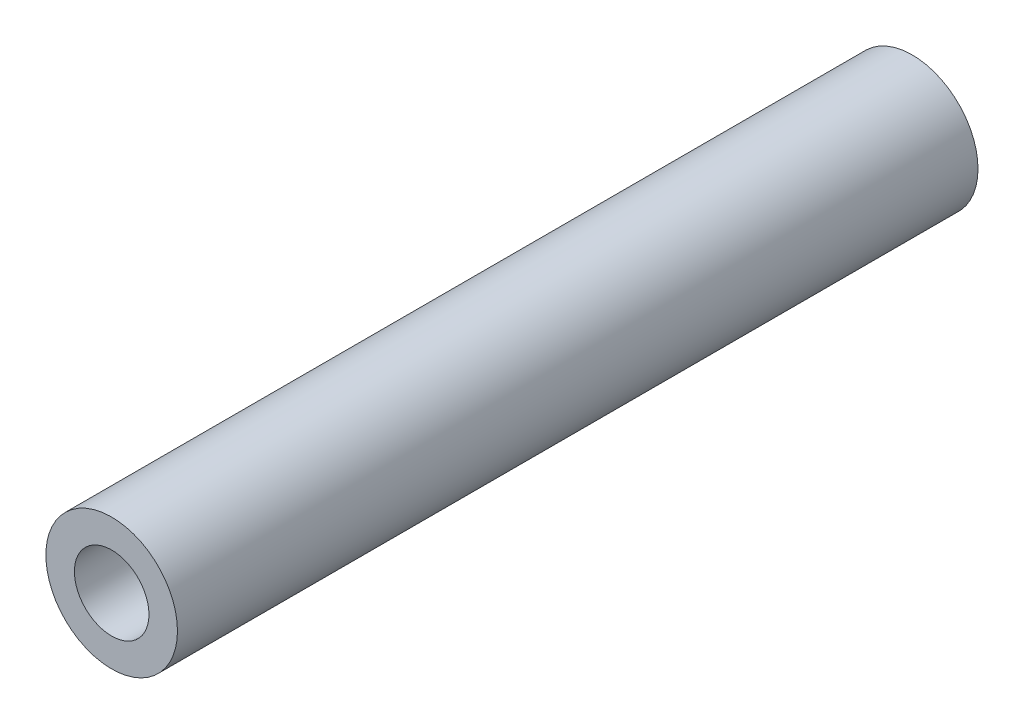
ISO-10303-21;
HEADER;
FILE_DESCRIPTION(('STEP AP214'),'2;1');
FILE_NAME('part.step','',(''),(''),'','','');
FILE_SCHEMA(('AUTOMOTIVE_DESIGN { 1 0 10303 214 1 1 1 1 }'));
ENDSEC;
DATA;
#1=APPLICATION_CONTEXT('core data for automotive mechanical design processes');
#2=APPLICATION_PROTOCOL_DEFINITION('international standard','automotive_design',2000,#1);
#3=PRODUCT_CONTEXT('',#1,'mechanical');
#4=PRODUCT('Part','Part','',(#3));
#5=PRODUCT_RELATED_PRODUCT_CATEGORY('part','',(#4));
#6=PRODUCT_DEFINITION_FORMATION('','',#4);
#7=PRODUCT_DEFINITION_CONTEXT('part definition',#1,'design');
#8=PRODUCT_DEFINITION('design','',#6,#7);
#9=PRODUCT_DEFINITION_SHAPE('','',#8);
#10=(LENGTH_UNIT() NAMED_UNIT(*) SI_UNIT(.MILLI.,.METRE.));
#11=(NAMED_UNIT(*) PLANE_ANGLE_UNIT() SI_UNIT($,.RADIAN.));
#12=(NAMED_UNIT(*) SI_UNIT($,.STERADIAN.) SOLID_ANGLE_UNIT());
#13=UNCERTAINTY_MEASURE_WITH_UNIT(LENGTH_MEASURE(1.E-05),#10,'distance_accuracy_value','');
#14=(GEOMETRIC_REPRESENTATION_CONTEXT(3) GLOBAL_UNCERTAINTY_ASSIGNED_CONTEXT((#13)) GLOBAL_UNIT_ASSIGNED_CONTEXT((#10,
#11,#12)) REPRESENTATION_CONTEXT('',''));
#15=CARTESIAN_POINT('',(0.,0.,0.));
#16=DIRECTION('',(0.,0.,1.));
#17=DIRECTION('',(1.,0.,0.));
#18=AXIS2_PLACEMENT_3D('',#15,#16,#17);
#19=CARTESIAN_POINT('',(-234.,-51.,48.5));
#20=DIRECTION('',(0.,0.,1.));
#21=DIRECTION('',(1.,0.,0.));
#22=AXIS2_PLACEMENT_3D('',#19,#20,#21);
#23=CYLINDRICAL_SURFACE('',#22,3.);
#24=CARTESIAN_POINT('',(-234.,-51.,48.5));
#25=DIRECTION('',(0.,0.,1.));
#26=DIRECTION('',(1.,0.,0.));
#27=AXIS2_PLACEMENT_3D('',#24,#25,#26);
#28=CIRCLE('',#27,3.);
#29=CARTESIAN_POINT('',(-231.,-51.,48.5));
#30=VERTEX_POINT('',#29);
#31=EDGE_CURVE('E10',#30,#30,#28,.T.);
#32=ORIENTED_EDGE('',*,*,#31,.T.);
#33=EDGE_LOOP('',(#32));
#34=FACE_BOUND('',#33,.T.);
#35=CARTESIAN_POINT('',(-234.,-51.,85.));
#36=DIRECTION('',(0.,0.,1.));
#37=DIRECTION('',(1.,0.,0.));
#38=AXIS2_PLACEMENT_3D('',#35,#36,#37);
#39=CIRCLE('',#38,3.);
#40=CARTESIAN_POINT('',(-231.,-51.,85.));
#41=VERTEX_POINT('',#40);
#42=EDGE_CURVE('E45',#41,#41,#39,.T.);
#43=ORIENTED_EDGE('',*,*,#42,.F.);
#44=EDGE_LOOP('',(#43));
#45=FACE_BOUND('',#44,.T.);
#46=ADVANCED_FACE('F39',(#34,#45),#23,.T.);
#47=CARTESIAN_POINT('',(-234.,-51.,48.5));
#48=DIRECTION('',(0.,0.,1.));
#49=DIRECTION('',(1.,0.,0.));
#50=AXIS2_PLACEMENT_3D('',#47,#48,#49);
#51=PLANE('',#50);
#52=CARTESIAN_POINT('',(-234.,-51.,48.5));
#53=DIRECTION('',(0.,0.,1.));
#54=DIRECTION('',(1.,0.,0.));
#55=AXIS2_PLACEMENT_3D('',#52,#53,#54);
#56=CIRCLE('',#55,1.70000000000001);
#57=CARTESIAN_POINT('',(-232.3,-51.,48.5));
#58=VERTEX_POINT('',#57);
#59=EDGE_CURVE('E47',#58,#58,#56,.T.);
#60=ORIENTED_EDGE('',*,*,#59,.T.);
#61=EDGE_LOOP('',(#60));
#62=FACE_BOUND('',#61,.T.);
#63=ORIENTED_EDGE('',*,*,#31,.F.);
#64=EDGE_LOOP('',(#63));
#65=FACE_BOUND('',#64,.T.);
#66=ADVANCED_FACE('F60',(#62,#65),#51,.F.);
#67=CARTESIAN_POINT('',(-234.,-51.,85.));
#68=DIRECTION('',(0.,0.,1.));
#69=DIRECTION('',(1.,0.,0.));
#70=AXIS2_PLACEMENT_3D('',#67,#68,#69);
#71=PLANE('',#70);
#72=CARTESIAN_POINT('',(-234.,-51.,85.));
#73=DIRECTION('',(0.,0.,1.));
#74=DIRECTION('',(1.,0.,0.));
#75=AXIS2_PLACEMENT_3D('',#72,#73,#74);
#76=CIRCLE('',#75,1.70000000000001);
#77=CARTESIAN_POINT('',(-232.3,-51.,85.));
#78=VERTEX_POINT('',#77);
#79=EDGE_CURVE('E51',#78,#78,#76,.T.);
#80=ORIENTED_EDGE('',*,*,#79,.F.);
#81=EDGE_LOOP('',(#80));
#82=FACE_BOUND('',#81,.T.);
#83=ORIENTED_EDGE('',*,*,#42,.T.);
#84=EDGE_LOOP('',(#83));
#85=FACE_BOUND('',#84,.T.);
#86=ADVANCED_FACE('F64',(#82,#85),#71,.T.);
#87=CARTESIAN_POINT('',(-234.,-51.,48.5));
#88=DIRECTION('',(0.,0.,1.));
#89=DIRECTION('',(1.,0.,0.));
#90=AXIS2_PLACEMENT_3D('',#87,#88,#89);
#91=CYLINDRICAL_SURFACE('',#90,1.70000000000001);
#92=ORIENTED_EDGE('',*,*,#59,.F.);
#93=EDGE_LOOP('',(#92));
#94=FACE_BOUND('',#93,.T.);
#95=ORIENTED_EDGE('',*,*,#79,.T.);
#96=EDGE_LOOP('',(#95));
#97=FACE_BOUND('',#96,.T.);
#98=ADVANCED_FACE('F58',(#94,#97),#91,.F.);
#99=CLOSED_SHELL('',(#46,#66,#86,#98));
#100=MANIFOLD_SOLID_BREP('B2',#99);
#101=ADVANCED_BREP_SHAPE_REPRESENTATION('',(#18,#100),#14);
#102=SHAPE_DEFINITION_REPRESENTATION(#9,#101);
ENDSEC;
END-ISO-10303-21;
